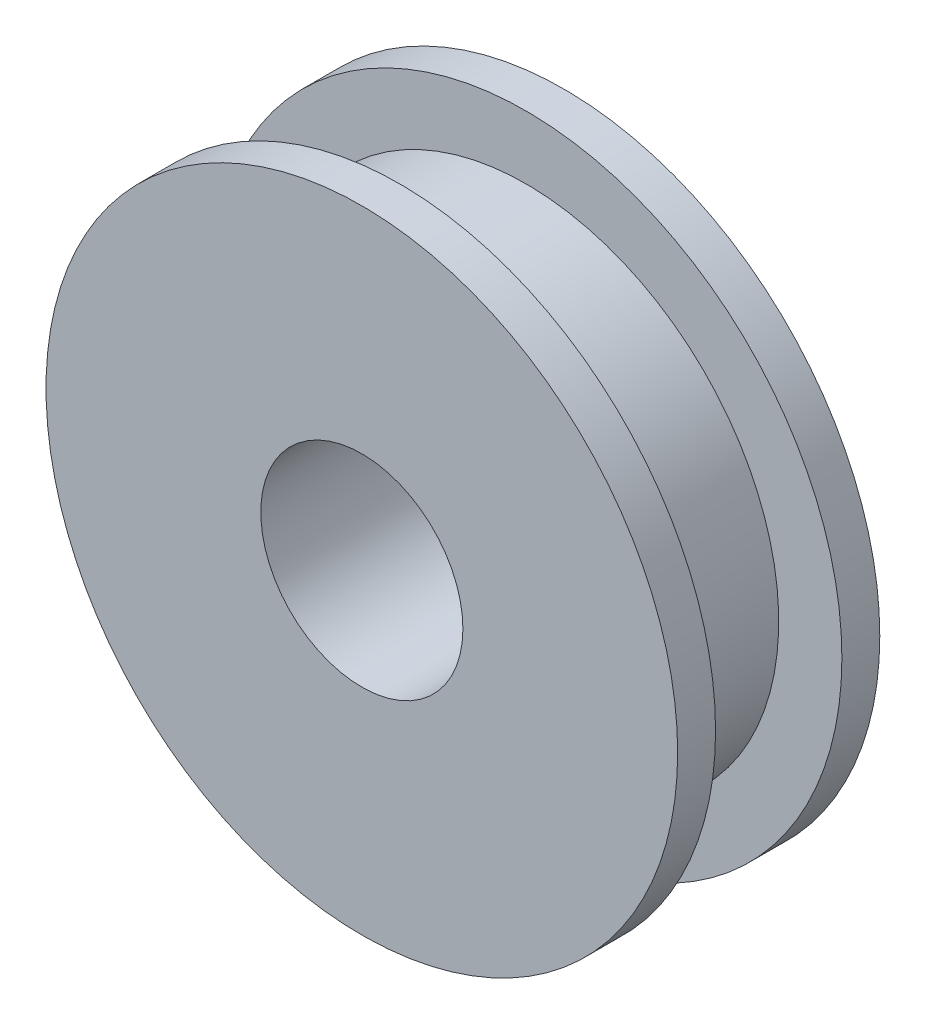
ISO-10303-21;
HEADER;
FILE_DESCRIPTION(('STEP AP214'),'2;1');
FILE_NAME('part.step','',(''),(''),'','','');
FILE_SCHEMA(('AUTOMOTIVE_DESIGN { 1 0 10303 214 1 1 1 1 }'));
ENDSEC;
DATA;
#1=APPLICATION_CONTEXT('core data for automotive mechanical design processes');
#2=APPLICATION_PROTOCOL_DEFINITION('international standard','automotive_design',2000,#1);
#3=PRODUCT_CONTEXT('',#1,'mechanical');
#4=PRODUCT('Part','Part','',(#3));
#5=PRODUCT_RELATED_PRODUCT_CATEGORY('part','',(#4));
#6=PRODUCT_DEFINITION_FORMATION('','',#4);
#7=PRODUCT_DEFINITION_CONTEXT('part definition',#1,'design');
#8=PRODUCT_DEFINITION('design','',#6,#7);
#9=PRODUCT_DEFINITION_SHAPE('','',#8);
#10=(LENGTH_UNIT() NAMED_UNIT(*) SI_UNIT(.MILLI.,.METRE.));
#11=(NAMED_UNIT(*) PLANE_ANGLE_UNIT() SI_UNIT($,.RADIAN.));
#12=(NAMED_UNIT(*) SI_UNIT($,.STERADIAN.) SOLID_ANGLE_UNIT());
#13=UNCERTAINTY_MEASURE_WITH_UNIT(LENGTH_MEASURE(1.E-05),#10,'distance_accuracy_value','');
#14=(GEOMETRIC_REPRESENTATION_CONTEXT(3) GLOBAL_UNCERTAINTY_ASSIGNED_CONTEXT((#13)) GLOBAL_UNIT_ASSIGNED_CONTEXT((#10,
#11,#12)) REPRESENTATION_CONTEXT('',''));
#15=CARTESIAN_POINT('',(0.,0.,0.));
#16=DIRECTION('',(0.,0.,1.));
#17=DIRECTION('',(1.,0.,0.));
#18=AXIS2_PLACEMENT_3D('',#15,#16,#17);
#19=CARTESIAN_POINT('',(0.,0.,5.));
#20=DIRECTION('',(0.,0.,-1.));
#21=DIRECTION('',(-1.,0.,0.));
#22=AXIS2_PLACEMENT_3D('',#19,#20,#21);
#23=CYLINDRICAL_SURFACE('',#22,20.);
#24=CARTESIAN_POINT('',(0.,0.,5.));
#25=DIRECTION('',(0.,0.,1.));
#26=DIRECTION('',(1.,0.,0.));
#27=AXIS2_PLACEMENT_3D('',#24,#25,#26);
#28=CIRCLE('',#27,20.);
#29=CARTESIAN_POINT('',(20.,0.,5.));
#30=VERTEX_POINT('',#29);
#31=EDGE_CURVE('E10',#30,#30,#28,.T.);
#32=ORIENTED_EDGE('',*,*,#31,.F.);
#33=EDGE_LOOP('',(#32));
#34=FACE_BOUND('',#33,.T.);
#35=CARTESIAN_POINT('',(0.,0.,-5.));
#36=DIRECTION('',(0.,0.,-1.));
#37=DIRECTION('',(-1.,0.,0.));
#38=AXIS2_PLACEMENT_3D('',#35,#36,#37);
#39=CIRCLE('',#38,20.);
#40=CARTESIAN_POINT('',(-20.,0.,-5.));
#41=VERTEX_POINT('',#40);
#42=EDGE_CURVE('E50',#41,#41,#39,.T.);
#43=ORIENTED_EDGE('',*,*,#42,.F.);
#44=EDGE_LOOP('',(#43));
#45=FACE_BOUND('',#44,.T.);
#46=ADVANCED_FACE('F31',(#34,#45),#23,.T.);
#47=CARTESIAN_POINT('',(0.,0.,5.));
#48=DIRECTION('',(0.,0.,-1.));
#49=DIRECTION('',(-1.,0.,0.));
#50=AXIS2_PLACEMENT_3D('',#47,#48,#49);
#51=CYLINDRICAL_SURFACE('',#50,8.);
#52=CARTESIAN_POINT('',(0.,0.,8.));
#53=DIRECTION('',(0.,0.,1.));
#54=DIRECTION('',(1.,0.,0.));
#55=AXIS2_PLACEMENT_3D('',#52,#53,#54);
#56=CIRCLE('',#55,8.);
#57=CARTESIAN_POINT('',(8.,0.,8.));
#58=VERTEX_POINT('',#57);
#59=EDGE_CURVE('E46',#58,#58,#56,.T.);
#60=ORIENTED_EDGE('',*,*,#59,.T.);
#61=EDGE_LOOP('',(#60));
#62=FACE_BOUND('',#61,.T.);
#63=CARTESIAN_POINT('',(0.,0.,-8.));
#64=DIRECTION('',(0.,0.,1.));
#65=DIRECTION('',(1.,0.,0.));
#66=AXIS2_PLACEMENT_3D('',#63,#64,#65);
#67=CIRCLE('',#66,8.);
#68=CARTESIAN_POINT('',(8.,0.,-8.));
#69=VERTEX_POINT('',#68);
#70=EDGE_CURVE('E57',#69,#69,#67,.T.);
#71=ORIENTED_EDGE('',*,*,#70,.F.);
#72=EDGE_LOOP('',(#71));
#73=FACE_BOUND('',#72,.T.);
#74=ADVANCED_FACE('F66',(#62,#73),#51,.F.);
#75=CARTESIAN_POINT('',(0.,0.,5.));
#76=DIRECTION('',(0.,0.,1.));
#77=DIRECTION('',(1.,0.,0.));
#78=AXIS2_PLACEMENT_3D('',#75,#76,#77);
#79=PLANE('',#78);
#80=CARTESIAN_POINT('',(0.,0.,5.));
#81=DIRECTION('',(0.,0.,1.));
#82=DIRECTION('',(1.,0.,0.));
#83=AXIS2_PLACEMENT_3D('',#80,#81,#82);
#84=CIRCLE('',#83,25.);
#85=CARTESIAN_POINT('',(25.,0.,5.));
#86=VERTEX_POINT('',#85);
#87=EDGE_CURVE('E41',#86,#86,#84,.T.);
#88=ORIENTED_EDGE('',*,*,#87,.F.);
#89=EDGE_LOOP('',(#88));
#90=FACE_BOUND('',#89,.T.);
#91=ORIENTED_EDGE('',*,*,#31,.T.);
#92=EDGE_LOOP('',(#91));
#93=FACE_BOUND('',#92,.T.);
#94=ADVANCED_FACE('F68',(#90,#93),#79,.F.);
#95=CARTESIAN_POINT('',(0.,0.,8.));
#96=DIRECTION('',(0.,0.,1.));
#97=DIRECTION('',(1.,0.,0.));
#98=AXIS2_PLACEMENT_3D('',#95,#96,#97);
#99=PLANE('',#98);
#100=CARTESIAN_POINT('',(0.,0.,8.));
#101=DIRECTION('',(0.,0.,1.));
#102=DIRECTION('',(1.,0.,0.));
#103=AXIS2_PLACEMENT_3D('',#100,#101,#102);
#104=CIRCLE('',#103,25.);
#105=CARTESIAN_POINT('',(25.,0.,8.));
#106=VERTEX_POINT('',#105);
#107=EDGE_CURVE('E37',#106,#106,#104,.T.);
#108=ORIENTED_EDGE('',*,*,#107,.T.);
#109=EDGE_LOOP('',(#108));
#110=FACE_BOUND('',#109,.T.);
#111=ORIENTED_EDGE('',*,*,#59,.F.);
#112=EDGE_LOOP('',(#111));
#113=FACE_BOUND('',#112,.T.);
#114=ADVANCED_FACE('F74',(#110,#113),#99,.T.);
#115=CARTESIAN_POINT('',(0.,0.,8.));
#116=DIRECTION('',(0.,0.,-1.));
#117=DIRECTION('',(-1.,0.,0.));
#118=AXIS2_PLACEMENT_3D('',#115,#116,#117);
#119=CYLINDRICAL_SURFACE('',#118,25.);
#120=ORIENTED_EDGE('',*,*,#107,.F.);
#121=EDGE_LOOP('',(#120));
#122=FACE_BOUND('',#121,.T.);
#123=ORIENTED_EDGE('',*,*,#87,.T.);
#124=EDGE_LOOP('',(#123));
#125=FACE_BOUND('',#124,.T.);
#126=ADVANCED_FACE('F79',(#122,#125),#119,.T.);
#127=CARTESIAN_POINT('',(0.,0.,-5.));
#128=DIRECTION('',(0.,0.,-1.));
#129=DIRECTION('',(1.,0.,0.));
#130=AXIS2_PLACEMENT_3D('',#127,#128,#129);
#131=PLANE('',#130);
#132=CARTESIAN_POINT('',(0.,0.,-5.));
#133=DIRECTION('',(0.,0.,1.));
#134=DIRECTION('',(1.,0.,0.));
#135=AXIS2_PLACEMENT_3D('',#132,#133,#134);
#136=CIRCLE('',#135,25.);
#137=CARTESIAN_POINT('',(25.,0.,-5.));
#138=VERTEX_POINT('',#137);
#139=EDGE_CURVE('E54',#138,#138,#136,.T.);
#140=ORIENTED_EDGE('',*,*,#139,.T.);
#141=EDGE_LOOP('',(#140));
#142=FACE_BOUND('',#141,.T.);
#143=ORIENTED_EDGE('',*,*,#42,.T.);
#144=EDGE_LOOP('',(#143));
#145=FACE_BOUND('',#144,.T.);
#146=ADVANCED_FACE('F81',(#142,#145),#131,.F.);
#147=CARTESIAN_POINT('',(0.,0.,-8.));
#148=DIRECTION('',(0.,0.,1.));
#149=DIRECTION('',(1.,0.,0.));
#150=AXIS2_PLACEMENT_3D('',#147,#148,#149);
#151=CYLINDRICAL_SURFACE('',#150,25.);
#152=CARTESIAN_POINT('',(0.,0.,-8.));
#153=DIRECTION('',(0.,0.,1.));
#154=DIRECTION('',(1.,0.,0.));
#155=AXIS2_PLACEMENT_3D('',#152,#153,#154);
#156=CIRCLE('',#155,25.);
#157=CARTESIAN_POINT('',(25.,0.,-8.));
#158=VERTEX_POINT('',#157);
#159=EDGE_CURVE('E53',#158,#158,#156,.T.);
#160=ORIENTED_EDGE('',*,*,#159,.T.);
#161=EDGE_LOOP('',(#160));
#162=FACE_BOUND('',#161,.T.);
#163=ORIENTED_EDGE('',*,*,#139,.F.);
#164=EDGE_LOOP('',(#163));
#165=FACE_BOUND('',#164,.T.);
#166=ADVANCED_FACE('F86',(#162,#165),#151,.T.);
#167=CARTESIAN_POINT('',(0.,0.,-8.));
#168=DIRECTION('',(0.,0.,-1.));
#169=DIRECTION('',(1.,0.,0.));
#170=AXIS2_PLACEMENT_3D('',#167,#168,#169);
#171=PLANE('',#170);
#172=ORIENTED_EDGE('',*,*,#70,.T.);
#173=EDGE_LOOP('',(#172));
#174=FACE_BOUND('',#173,.T.);
#175=ORIENTED_EDGE('',*,*,#159,.F.);
#176=EDGE_LOOP('',(#175));
#177=FACE_BOUND('',#176,.T.);
#178=ADVANCED_FACE('F63',(#174,#177),#171,.T.);
#179=CLOSED_SHELL('',(#46,#74,#94,#114,#126,#146,#166,#178));
#180=MANIFOLD_SOLID_BREP('B2',#179);
#181=ADVANCED_BREP_SHAPE_REPRESENTATION('',(#18,#180),#14);
#182=SHAPE_DEFINITION_REPRESENTATION(#9,#181);
ENDSEC;
END-ISO-10303-21;
